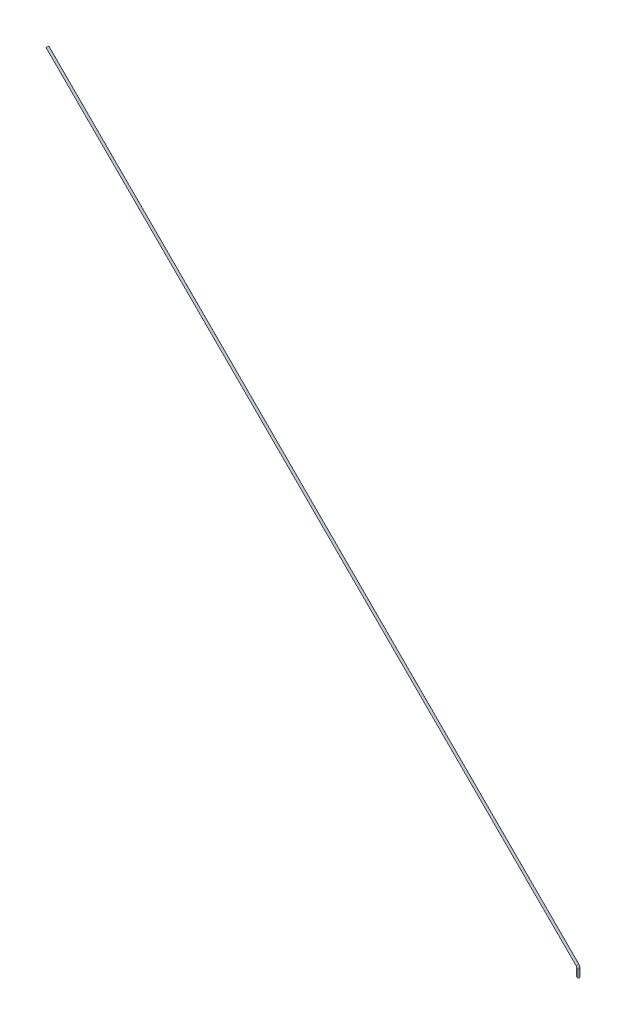
ISO-10303-21;
HEADER;
FILE_DESCRIPTION(('STEP AP214'),'2;1');
FILE_NAME('part.step','',(''),(''),'','','');
FILE_SCHEMA(('AUTOMOTIVE_DESIGN { 1 0 10303 214 1 1 1 1 }'));
ENDSEC;
DATA;
#1=APPLICATION_CONTEXT('core data for automotive mechanical design processes');
#2=APPLICATION_PROTOCOL_DEFINITION('international standard','automotive_design',2000,#1);
#3=PRODUCT_CONTEXT('',#1,'mechanical');
#4=PRODUCT('Part','Part','',(#3));
#5=PRODUCT_RELATED_PRODUCT_CATEGORY('part','',(#4));
#6=PRODUCT_DEFINITION_FORMATION('','',#4);
#7=PRODUCT_DEFINITION_CONTEXT('part definition',#1,'design');
#8=PRODUCT_DEFINITION('design','',#6,#7);
#9=PRODUCT_DEFINITION_SHAPE('','',#8);
#10=(LENGTH_UNIT() NAMED_UNIT(*) SI_UNIT(.MILLI.,.METRE.));
#11=(NAMED_UNIT(*) PLANE_ANGLE_UNIT() SI_UNIT($,.RADIAN.));
#12=(NAMED_UNIT(*) SI_UNIT($,.STERADIAN.) SOLID_ANGLE_UNIT());
#13=UNCERTAINTY_MEASURE_WITH_UNIT(LENGTH_MEASURE(1.E-05),#10,'distance_accuracy_value','');
#14=(GEOMETRIC_REPRESENTATION_CONTEXT(3) GLOBAL_UNCERTAINTY_ASSIGNED_CONTEXT((#13)) GLOBAL_UNIT_ASSIGNED_CONTEXT((#10,
#11,#12)) REPRESENTATION_CONTEXT('',''));
#15=CARTESIAN_POINT('',(0.,0.,0.));
#16=DIRECTION('',(0.,0.,1.));
#17=DIRECTION('',(1.,0.,0.));
#18=AXIS2_PLACEMENT_3D('',#15,#16,#17);
#19=CARTESIAN_POINT('',(0.,0.,0.));
#20=DIRECTION('',(0.,1.,0.));
#21=DIRECTION('',(0.,0.,1.));
#22=AXIS2_PLACEMENT_3D('',#19,#20,#21);
#23=PLANE('',#22);
#24=CARTESIAN_POINT('',(0.,0.,0.));
#25=DIRECTION('',(0.,-1.,0.));
#26=DIRECTION('',(1.,0.,0.));
#27=AXIS2_PLACEMENT_3D('',#24,#25,#26);
#28=CIRCLE('',#27,0.25);
#29=CARTESIAN_POINT('',(0.25,0.,0.));
#30=VERTEX_POINT('',#29);
#31=EDGE_CURVE('E18',#30,#30,#28,.F.);
#32=ORIENTED_EDGE('',*,*,#31,.F.);
#33=EDGE_LOOP('',(#32));
#34=FACE_BOUND('',#33,.T.);
#35=ADVANCED_FACE('F15',(#34),#23,.F.);
#36=CARTESIAN_POINT('',(0.,1.68933982822018,0.));
#37=DIRECTION('',(0.,-1.,0.));
#38=DIRECTION('',(1.,0.,0.));
#39=AXIS2_PLACEMENT_3D('',#36,#37,#38);
#40=CYLINDRICAL_SURFACE('',#39,0.25);
#41=ORIENTED_EDGE('',*,*,#31,.T.);
#42=EDGE_LOOP('',(#41));
#43=FACE_BOUND('',#42,.T.);
#44=CARTESIAN_POINT('',(0.,1.68933982822018,0.));
#45=DIRECTION('',(0.,1.,0.));
#46=DIRECTION('',(1.,0.,0.));
#47=AXIS2_PLACEMENT_3D('',#44,#45,#46);
#48=CIRCLE('',#47,0.25);
#49=CARTESIAN_POINT('',(0.25,1.68933982822018,0.));
#50=VERTEX_POINT('',#49);
#51=EDGE_CURVE('E26',#50,#50,#48,.T.);
#52=ORIENTED_EDGE('',*,*,#51,.F.);
#53=EDGE_LOOP('',(#52));
#54=FACE_BOUND('',#53,.T.);
#55=ADVANCED_FACE('F37',(#43,#54),#40,.T.);
#56=CARTESIAN_POINT('',(-0.75,1.68933982822018,0.));
#57=DIRECTION('',(0.,0.,1.));
#58=DIRECTION('',(1.,0.,0.));
#59=AXIS2_PLACEMENT_3D('',#56,#57,#58);
#60=TOROIDAL_SURFACE('',#59,0.75,0.25);
#61=ORIENTED_EDGE('',*,*,#51,.T.);
#62=EDGE_LOOP('',(#61));
#63=FACE_BOUND('',#62,.T.);
#64=CARTESIAN_POINT('',(-0.219669914110089,2.21966991411009,0.));
#65=DIRECTION('',(-0.707106781186549,0.707106781186546,0.));
#66=DIRECTION('',(-0.707106781186546,-0.707106781186549,0.));
#67=AXIS2_PLACEMENT_3D('',#64,#65,#66);
#68=CIRCLE('',#67,0.25);
#69=CARTESIAN_POINT('',(-0.396446609406725,2.04289321881345,0.));
#70=VERTEX_POINT('',#69);
#71=EDGE_CURVE('E22',#70,#70,#68,.T.);
#72=ORIENTED_EDGE('',*,*,#71,.F.);
#73=EDGE_LOOP('',(#72));
#74=FACE_BOUND('',#73,.T.);
#75=ADVANCED_FACE('F33',(#63,#74),#60,.T.);
#76=CARTESIAN_POINT('',(-115.258405333407,117.258405333407,0.));
#77=DIRECTION('',(-0.707106781186549,0.707106781186546,0.));
#78=DIRECTION('',(-0.707106781186546,-0.707106781186549,0.));
#79=AXIS2_PLACEMENT_3D('',#76,#77,#78);
#80=PLANE('',#79);
#81=CARTESIAN_POINT('',(-115.258405333408,117.258405333407,0.));
#82=DIRECTION('',(-0.707106781186549,0.707106781186546,0.));
#83=DIRECTION('',(-0.707106781186546,-0.707106781186549,0.));
#84=AXIS2_PLACEMENT_3D('',#81,#82,#83);
#85=CIRCLE('',#84,0.25);
#86=CARTESIAN_POINT('',(-115.435182028704,117.081628638111,0.));
#87=VERTEX_POINT('',#86);
#88=EDGE_CURVE('E10',#87,#87,#85,.F.);
#89=ORIENTED_EDGE('',*,*,#88,.F.);
#90=EDGE_LOOP('',(#89));
#91=FACE_BOUND('',#90,.T.);
#92=ADVANCED_FACE('F36',(#91),#80,.T.);
#93=CARTESIAN_POINT('',(-0.21966991411009,2.21966991411009,0.));
#94=DIRECTION('',(-0.707106781186549,0.707106781186546,0.));
#95=DIRECTION('',(-0.707106781186546,-0.707106781186549,0.));
#96=AXIS2_PLACEMENT_3D('',#93,#94,#95);
#97=CYLINDRICAL_SURFACE('',#96,0.25);
#98=ORIENTED_EDGE('',*,*,#88,.T.);
#99=EDGE_LOOP('',(#98));
#100=FACE_BOUND('',#99,.T.);
#101=ORIENTED_EDGE('',*,*,#71,.T.);
#102=EDGE_LOOP('',(#101));
#103=FACE_BOUND('',#102,.T.);
#104=ADVANCED_FACE('F49',(#100,#103),#97,.T.);
#105=CLOSED_SHELL('',(#35,#55,#75,#92,#104));
#106=MANIFOLD_SOLID_BREP('B1',#105);
#107=ADVANCED_BREP_SHAPE_REPRESENTATION('',(#18,#106),#14);
#108=SHAPE_DEFINITION_REPRESENTATION(#9,#107);
ENDSEC;
END-ISO-10303-21;
